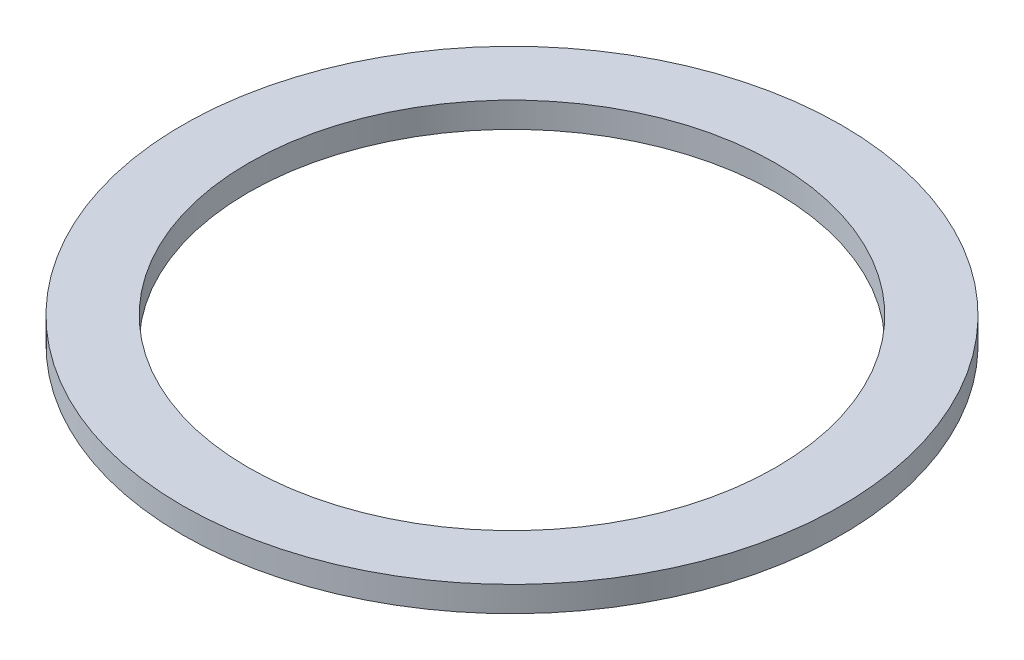
ISO-10303-21;
HEADER;
FILE_DESCRIPTION(('STEP AP214'),'2;1');
FILE_NAME('part.step','',(''),(''),'','','');
FILE_SCHEMA(('AUTOMOTIVE_DESIGN { 1 0 10303 214 1 1 1 1 }'));
ENDSEC;
DATA;
#1=APPLICATION_CONTEXT('core data for automotive mechanical design processes');
#2=APPLICATION_PROTOCOL_DEFINITION('international standard','automotive_design',2000,#1);
#3=PRODUCT_CONTEXT('',#1,'mechanical');
#4=PRODUCT('Part','Part','',(#3));
#5=PRODUCT_RELATED_PRODUCT_CATEGORY('part','',(#4));
#6=PRODUCT_DEFINITION_FORMATION('','',#4);
#7=PRODUCT_DEFINITION_CONTEXT('part definition',#1,'design');
#8=PRODUCT_DEFINITION('design','',#6,#7);
#9=PRODUCT_DEFINITION_SHAPE('','',#8);
#10=(LENGTH_UNIT() NAMED_UNIT(*) SI_UNIT(.MILLI.,.METRE.));
#11=(NAMED_UNIT(*) PLANE_ANGLE_UNIT() SI_UNIT($,.RADIAN.));
#12=(NAMED_UNIT(*) SI_UNIT($,.STERADIAN.) SOLID_ANGLE_UNIT());
#13=UNCERTAINTY_MEASURE_WITH_UNIT(LENGTH_MEASURE(1.E-05),#10,'distance_accuracy_value','');
#14=(GEOMETRIC_REPRESENTATION_CONTEXT(3) GLOBAL_UNCERTAINTY_ASSIGNED_CONTEXT((#13)) GLOBAL_UNIT_ASSIGNED_CONTEXT((#10,
#11,#12)) REPRESENTATION_CONTEXT('',''));
#15=CARTESIAN_POINT('',(0.,0.,0.));
#16=DIRECTION('',(0.,0.,1.));
#17=DIRECTION('',(1.,0.,0.));
#18=AXIS2_PLACEMENT_3D('',#15,#16,#17);
#19=CARTESIAN_POINT('',(0.,3.81,0.));
#20=DIRECTION('',(0.,-1.,0.));
#21=DIRECTION('',(0.,0.,-1.));
#22=AXIS2_PLACEMENT_3D('',#19,#20,#21);
#23=CYLINDRICAL_SURFACE('',#22,39.624);
#24=CARTESIAN_POINT('',(0.,3.81,0.));
#25=DIRECTION('',(0.,1.,0.));
#26=DIRECTION('',(0.,0.,1.));
#27=AXIS2_PLACEMENT_3D('',#24,#25,#26);
#28=CIRCLE('',#27,39.624);
#29=CARTESIAN_POINT('',(0.,3.81,-39.624));
#30=VERTEX_POINT('',#29);
#31=EDGE_CURVE('E53',#30,#30,#28,.T.);
#32=CARTESIAN_POINT('',(0.,0.,0.));
#33=DIRECTION('',(0.,1.,0.));
#34=DIRECTION('',(0.,0.,1.));
#35=AXIS2_PLACEMENT_3D('',#32,#33,#34);
#36=CIRCLE('',#35,39.624);
#37=CARTESIAN_POINT('',(0.,0.,-39.624));
#38=VERTEX_POINT('',#37);
#39=EDGE_CURVE('E60',#38,#38,#36,.T.);
#40=CARTESIAN_POINT('',(0.,3.81,-39.624));
#41=CARTESIAN_POINT('',(0.,3.7703125,-39.624));
#42=CARTESIAN_POINT('',(0.,3.730625,-39.624));
#43=CARTESIAN_POINT('',(0.,3.65125,-39.624));
#44=CARTESIAN_POINT('',(0.,3.6115625,-39.624));
#45=CARTESIAN_POINT('',(0.,3.5321875,-39.624));
#46=CARTESIAN_POINT('',(0.,3.4925,-39.624));
#47=CARTESIAN_POINT('',(0.,3.413125,-39.624));
#48=CARTESIAN_POINT('',(0.,3.3734375,-39.624));
#49=CARTESIAN_POINT('',(0.,3.2940625,-39.624));
#50=CARTESIAN_POINT('',(0.,3.254375,-39.624));
#51=CARTESIAN_POINT('',(0.,3.175,-39.624));
#52=CARTESIAN_POINT('',(0.,3.1353125,-39.624));
#53=CARTESIAN_POINT('',(0.,3.0559375,-39.624));
#54=CARTESIAN_POINT('',(0.,3.01625,-39.624));
#55=CARTESIAN_POINT('',(0.,2.936875,-39.624));
#56=CARTESIAN_POINT('',(0.,2.8971875,-39.624));
#57=CARTESIAN_POINT('',(0.,2.8178125,-39.624));
#58=CARTESIAN_POINT('',(0.,2.778125,-39.624));
#59=CARTESIAN_POINT('',(0.,2.69875,-39.624));
#60=CARTESIAN_POINT('',(0.,2.6590625,-39.624));
#61=CARTESIAN_POINT('',(0.,2.5796875,-39.624));
#62=CARTESIAN_POINT('',(0.,2.54,-39.624));
#63=CARTESIAN_POINT('',(0.,2.460625,-39.624));
#64=CARTESIAN_POINT('',(0.,2.4209375,-39.624));
#65=CARTESIAN_POINT('',(0.,2.3415625,-39.624));
#66=CARTESIAN_POINT('',(0.,2.301875,-39.624));
#67=CARTESIAN_POINT('',(0.,2.2225,-39.624));
#68=CARTESIAN_POINT('',(0.,2.1828125,-39.624));
#69=CARTESIAN_POINT('',(0.,2.1034375,-39.624));
#70=CARTESIAN_POINT('',(0.,2.06375,-39.624));
#71=CARTESIAN_POINT('',(0.,1.984375,-39.624));
#72=CARTESIAN_POINT('',(0.,1.9446875,-39.624));
#73=CARTESIAN_POINT('',(0.,1.8653125,-39.624));
#74=CARTESIAN_POINT('',(0.,1.825625,-39.624));
#75=CARTESIAN_POINT('',(0.,1.74625,-39.624));
#76=CARTESIAN_POINT('',(0.,1.7065625,-39.624));
#77=CARTESIAN_POINT('',(0.,1.6271875,-39.624));
#78=CARTESIAN_POINT('',(0.,1.5875,-39.624));
#79=CARTESIAN_POINT('',(0.,1.508125,-39.624));
#80=CARTESIAN_POINT('',(0.,1.4684375,-39.624));
#81=CARTESIAN_POINT('',(0.,1.3890625,-39.624));
#82=CARTESIAN_POINT('',(0.,1.349375,-39.624));
#83=CARTESIAN_POINT('',(0.,1.27,-39.624));
#84=CARTESIAN_POINT('',(0.,1.2303125,-39.624));
#85=CARTESIAN_POINT('',(0.,1.1509375,-39.624));
#86=CARTESIAN_POINT('',(0.,1.11125,-39.624));
#87=CARTESIAN_POINT('',(0.,1.031875,-39.624));
#88=CARTESIAN_POINT('',(0.,0.9921875,-39.624));
#89=CARTESIAN_POINT('',(0.,0.9128125,-39.624));
#90=CARTESIAN_POINT('',(0.,0.873125,-39.624));
#91=CARTESIAN_POINT('',(0.,0.79375,-39.624));
#92=CARTESIAN_POINT('',(0.,0.7540625,-39.624));
#93=CARTESIAN_POINT('',(0.,0.6746875,-39.624));
#94=CARTESIAN_POINT('',(0.,0.635,-39.624));
#95=CARTESIAN_POINT('',(0.,0.555625,-39.624));
#96=CARTESIAN_POINT('',(0.,0.5159375,-39.624));
#97=CARTESIAN_POINT('',(0.,0.4365625,-39.624));
#98=CARTESIAN_POINT('',(0.,0.396875,-39.624));
#99=CARTESIAN_POINT('',(0.,0.3175,-39.624));
#100=CARTESIAN_POINT('',(0.,0.2778125,-39.624));
#101=CARTESIAN_POINT('',(0.,0.1984375,-39.624));
#102=CARTESIAN_POINT('',(0.,0.15875,-39.624));
#103=CARTESIAN_POINT('',(0.,0.0793749999999999,-39.624));
#104=CARTESIAN_POINT('',(0.,0.0396874999999999,-39.624));
#105=CARTESIAN_POINT('',(0.,0.,-39.624));
#106=B_SPLINE_CURVE_WITH_KNOTS('',3,(#40,#41,#42,#43,#44,#45,#46,#47,#48,#49,#50,#51,#52,#53,
#54,#55,#56,#57,#58,#59,#60,#61,#62,#63,#64,#65,#66,#67,#68,#69,#70,#71,#72,#73,#74,#75,#76,#77,
#78,#79,#80,#81,#82,#83,#84,#85,#86,#87,#88,#89,#90,#91,#92,#93,#94,#95,#96,#97,#98,#99,#100,
#101,#102,#103,#104,#105),.UNSPECIFIED.,.F.,.F.,(4,2,2,2,2,2,2,2,2,2,2,2,2,2,2,2,2,2,2,2,2,2,2,
2,2,2,2,2,2,2,2,2,4),(0.,0.1190625,0.238125,0.3571875,0.47625,0.595312499999999,0.714375,
0.833437499999999,0.952499999999999,1.0715625,1.190625,1.3096875,1.42875,1.5478125,1.666875,
1.7859375,1.905,2.0240625,2.143125,2.2621875,2.38125,2.5003125,2.619375,2.7384375,2.8575,
2.9765625,3.095625,3.2146875,3.33375,3.4528125,3.571875,3.6909375,3.81),.UNSPECIFIED.);
#107=EDGE_CURVE('BSEAM45',#30,#38,#106,.T.);
#108=ORIENTED_EDGE('',*,*,#31,.T.);
#109=ORIENTED_EDGE('',*,*,#39,.F.);
#110=ORIENTED_EDGE('',*,*,#107,.T.);
#111=ORIENTED_EDGE('',*,*,#107,.F.);
#112=EDGE_LOOP('',(#108,#110,#109,#111));
#113=FACE_BOUND('',#112,.T.);
#114=ADVANCED_FACE('F45',(#113),#23,.F.);
#115=CARTESIAN_POINT('',(0.,3.81,0.));
#116=DIRECTION('',(0.,-1.,0.));
#117=DIRECTION('',(0.,0.,-1.));
#118=AXIS2_PLACEMENT_3D('',#115,#116,#117);
#119=CYLINDRICAL_SURFACE('',#118,49.53);
#120=CARTESIAN_POINT('',(0.,3.81,0.));
#121=DIRECTION('',(0.,1.,0.));
#122=DIRECTION('',(0.,0.,1.));
#123=AXIS2_PLACEMENT_3D('',#120,#121,#122);
#124=CIRCLE('',#123,49.53);
#125=CARTESIAN_POINT('',(0.,3.81,-49.53));
#126=VERTEX_POINT('',#125);
#127=EDGE_CURVE('E10',#126,#126,#124,.T.);
#128=CARTESIAN_POINT('',(0.,0.,0.));
#129=DIRECTION('',(0.,1.,0.));
#130=DIRECTION('',(0.,0.,1.));
#131=AXIS2_PLACEMENT_3D('',#128,#129,#130);
#132=CIRCLE('',#131,49.53);
#133=CARTESIAN_POINT('',(0.,0.,-49.53));
#134=VERTEX_POINT('',#133);
#135=EDGE_CURVE('E48',#134,#134,#132,.T.);
#136=CARTESIAN_POINT('',(0.,3.81,-49.53));
#137=CARTESIAN_POINT('',(0.,3.7703125,-49.53));
#138=CARTESIAN_POINT('',(0.,3.730625,-49.53));
#139=CARTESIAN_POINT('',(0.,3.65125,-49.53));
#140=CARTESIAN_POINT('',(0.,3.6115625,-49.53));
#141=CARTESIAN_POINT('',(0.,3.5321875,-49.53));
#142=CARTESIAN_POINT('',(0.,3.4925,-49.53));
#143=CARTESIAN_POINT('',(0.,3.413125,-49.53));
#144=CARTESIAN_POINT('',(0.,3.3734375,-49.53));
#145=CARTESIAN_POINT('',(0.,3.2940625,-49.53));
#146=CARTESIAN_POINT('',(0.,3.254375,-49.53));
#147=CARTESIAN_POINT('',(0.,3.175,-49.53));
#148=CARTESIAN_POINT('',(0.,3.1353125,-49.53));
#149=CARTESIAN_POINT('',(0.,3.0559375,-49.53));
#150=CARTESIAN_POINT('',(0.,3.01625,-49.53));
#151=CARTESIAN_POINT('',(0.,2.936875,-49.53));
#152=CARTESIAN_POINT('',(0.,2.8971875,-49.53));
#153=CARTESIAN_POINT('',(0.,2.8178125,-49.53));
#154=CARTESIAN_POINT('',(0.,2.778125,-49.53));
#155=CARTESIAN_POINT('',(0.,2.69875,-49.53));
#156=CARTESIAN_POINT('',(0.,2.6590625,-49.53));
#157=CARTESIAN_POINT('',(0.,2.5796875,-49.53));
#158=CARTESIAN_POINT('',(0.,2.54,-49.53));
#159=CARTESIAN_POINT('',(0.,2.460625,-49.53));
#160=CARTESIAN_POINT('',(0.,2.4209375,-49.53));
#161=CARTESIAN_POINT('',(0.,2.3415625,-49.53));
#162=CARTESIAN_POINT('',(0.,2.301875,-49.53));
#163=CARTESIAN_POINT('',(0.,2.2225,-49.53));
#164=CARTESIAN_POINT('',(0.,2.1828125,-49.53));
#165=CARTESIAN_POINT('',(0.,2.1034375,-49.53));
#166=CARTESIAN_POINT('',(0.,2.06375,-49.53));
#167=CARTESIAN_POINT('',(0.,1.984375,-49.53));
#168=CARTESIAN_POINT('',(0.,1.9446875,-49.53));
#169=CARTESIAN_POINT('',(0.,1.8653125,-49.53));
#170=CARTESIAN_POINT('',(0.,1.825625,-49.53));
#171=CARTESIAN_POINT('',(0.,1.74625,-49.53));
#172=CARTESIAN_POINT('',(0.,1.7065625,-49.53));
#173=CARTESIAN_POINT('',(0.,1.6271875,-49.53));
#174=CARTESIAN_POINT('',(0.,1.5875,-49.53));
#175=CARTESIAN_POINT('',(0.,1.508125,-49.53));
#176=CARTESIAN_POINT('',(0.,1.4684375,-49.53));
#177=CARTESIAN_POINT('',(0.,1.3890625,-49.53));
#178=CARTESIAN_POINT('',(0.,1.349375,-49.53));
#179=CARTESIAN_POINT('',(0.,1.27,-49.53));
#180=CARTESIAN_POINT('',(0.,1.2303125,-49.53));
#181=CARTESIAN_POINT('',(0.,1.1509375,-49.53));
#182=CARTESIAN_POINT('',(0.,1.11125,-49.53));
#183=CARTESIAN_POINT('',(0.,1.031875,-49.53));
#184=CARTESIAN_POINT('',(0.,0.9921875,-49.53));
#185=CARTESIAN_POINT('',(0.,0.9128125,-49.53));
#186=CARTESIAN_POINT('',(0.,0.873125,-49.53));
#187=CARTESIAN_POINT('',(0.,0.79375,-49.53));
#188=CARTESIAN_POINT('',(0.,0.7540625,-49.53));
#189=CARTESIAN_POINT('',(0.,0.6746875,-49.53));
#190=CARTESIAN_POINT('',(0.,0.635,-49.53));
#191=CARTESIAN_POINT('',(0.,0.555625,-49.53));
#192=CARTESIAN_POINT('',(0.,0.5159375,-49.53));
#193=CARTESIAN_POINT('',(0.,0.4365625,-49.53));
#194=CARTESIAN_POINT('',(0.,0.396875,-49.53));
#195=CARTESIAN_POINT('',(0.,0.3175,-49.53));
#196=CARTESIAN_POINT('',(0.,0.2778125,-49.53));
#197=CARTESIAN_POINT('',(0.,0.1984375,-49.53));
#198=CARTESIAN_POINT('',(0.,0.15875,-49.53));
#199=CARTESIAN_POINT('',(0.,0.0793749999999999,-49.53));
#200=CARTESIAN_POINT('',(0.,0.0396874999999999,-49.53));
#201=CARTESIAN_POINT('',(0.,0.,-49.53));
#202=B_SPLINE_CURVE_WITH_KNOTS('',3,(#136,#137,#138,#139,#140,#141,#142,#143,#144,#145,#146,
#147,#148,#149,#150,#151,#152,#153,#154,#155,#156,#157,#158,#159,#160,#161,#162,#163,#164,#165,
#166,#167,#168,#169,#170,#171,#172,#173,#174,#175,#176,#177,#178,#179,#180,#181,#182,#183,#184,
#185,#186,#187,#188,#189,#190,#191,#192,#193,#194,#195,#196,#197,#198,#199,#200,#201),
.UNSPECIFIED.,.F.,.F.,(4,2,2,2,2,2,2,2,2,2,2,2,2,2,2,2,2,2,2,2,2,2,2,2,2,2,2,2,2,2,2,2,4),(0.,
0.1190625,0.238125,0.3571875,0.47625,0.5953125,0.714375,0.8334375,0.9525,1.0715625,1.190625,
1.3096875,1.42875,1.5478125,1.666875,1.7859375,1.905,2.0240625,2.143125,2.2621875,2.38125,
2.5003125,2.619375,2.7384375,2.8575,2.9765625,3.095625,3.2146875,3.33375,3.4528125,3.571875,
3.6909375,3.81),.UNSPECIFIED.);
#203=EDGE_CURVE('BSEAM69',#126,#134,#202,.T.);
#204=ORIENTED_EDGE('',*,*,#127,.F.);
#205=ORIENTED_EDGE('',*,*,#135,.T.);
#206=ORIENTED_EDGE('',*,*,#203,.T.);
#207=ORIENTED_EDGE('',*,*,#203,.F.);
#208=EDGE_LOOP('',(#204,#206,#205,#207));
#209=FACE_BOUND('',#208,.T.);
#210=ADVANCED_FACE('F69',(#209),#119,.T.);
#211=CARTESIAN_POINT('',(0.,3.81,0.));
#212=DIRECTION('',(0.,1.,0.));
#213=DIRECTION('',(0.,0.,1.));
#214=AXIS2_PLACEMENT_3D('',#211,#212,#213);
#215=PLANE('',#214);
#216=ORIENTED_EDGE('',*,*,#31,.F.);
#217=EDGE_LOOP('',(#216));
#218=FACE_BOUND('',#217,.T.);
#219=ORIENTED_EDGE('',*,*,#127,.T.);
#220=EDGE_LOOP('',(#219));
#221=FACE_BOUND('',#220,.T.);
#222=ADVANCED_FACE('F73',(#218,#221),#215,.T.);
#223=CARTESIAN_POINT('',(0.,0.,0.));
#224=DIRECTION('',(0.,1.,0.));
#225=DIRECTION('',(0.,0.,1.));
#226=AXIS2_PLACEMENT_3D('',#223,#224,#225);
#227=PLANE('',#226);
#228=ORIENTED_EDGE('',*,*,#39,.T.);
#229=EDGE_LOOP('',(#228));
#230=FACE_BOUND('',#229,.T.);
#231=ORIENTED_EDGE('',*,*,#135,.F.);
#232=EDGE_LOOP('',(#231));
#233=FACE_BOUND('',#232,.T.);
#234=ADVANCED_FACE('F71',(#230,#233),#227,.F.);
#235=CLOSED_SHELL('',(#114,#210,#222,#234));
#236=MANIFOLD_SOLID_BREP('B2',#235);
#237=ADVANCED_BREP_SHAPE_REPRESENTATION('',(#18,#236),#14);
#238=SHAPE_DEFINITION_REPRESENTATION(#9,#237);
ENDSEC;
END-ISO-10303-21;
